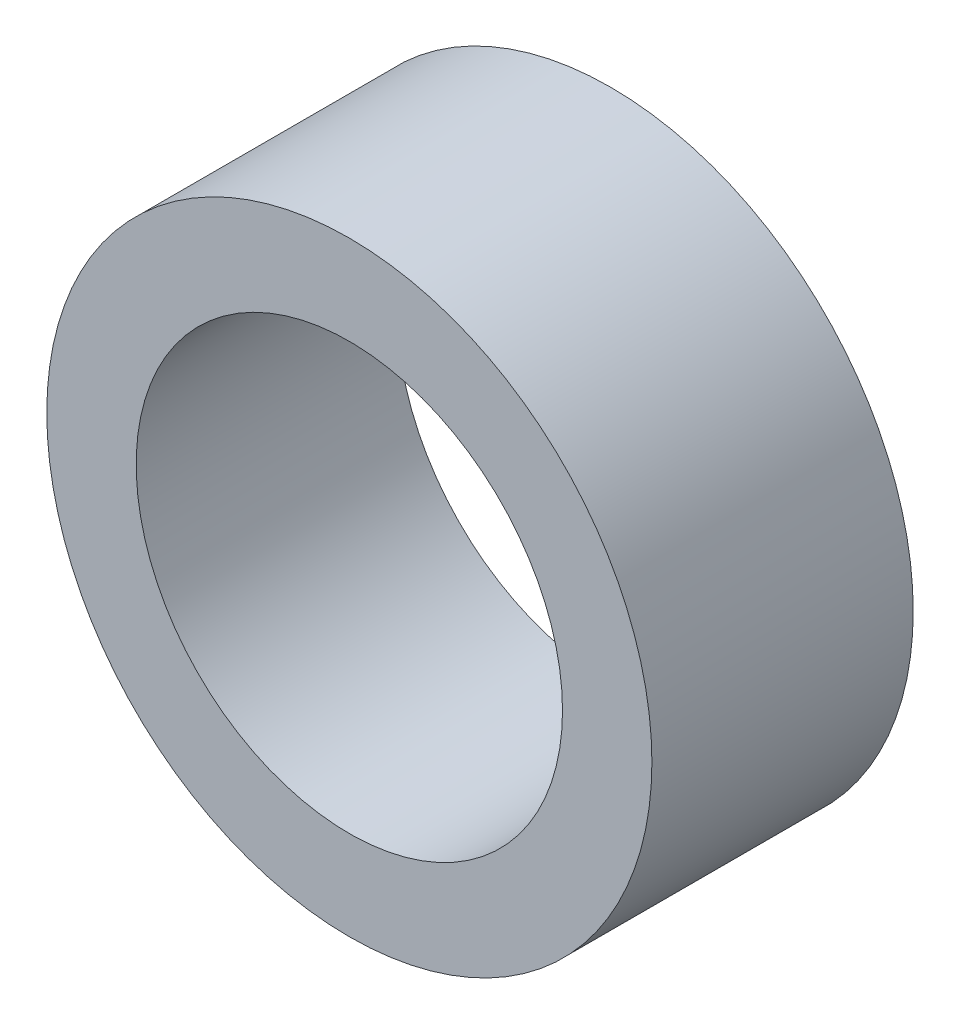
ISO-10303-21;
HEADER;
FILE_DESCRIPTION(('STEP AP214'),'2;1');
FILE_NAME('part.step','',(''),(''),'','','');
FILE_SCHEMA(('AUTOMOTIVE_DESIGN { 1 0 10303 214 1 1 1 1 }'));
ENDSEC;
DATA;
#1=APPLICATION_CONTEXT('core data for automotive mechanical design processes');
#2=APPLICATION_PROTOCOL_DEFINITION('international standard','automotive_design',2000,#1);
#3=PRODUCT_CONTEXT('',#1,'mechanical');
#4=PRODUCT('Part','Part','',(#3));
#5=PRODUCT_RELATED_PRODUCT_CATEGORY('part','',(#4));
#6=PRODUCT_DEFINITION_FORMATION('','',#4);
#7=PRODUCT_DEFINITION_CONTEXT('part definition',#1,'design');
#8=PRODUCT_DEFINITION('design','',#6,#7);
#9=PRODUCT_DEFINITION_SHAPE('','',#8);
#10=(LENGTH_UNIT() NAMED_UNIT(*) SI_UNIT(.MILLI.,.METRE.));
#11=(NAMED_UNIT(*) PLANE_ANGLE_UNIT() SI_UNIT($,.RADIAN.));
#12=(NAMED_UNIT(*) SI_UNIT($,.STERADIAN.) SOLID_ANGLE_UNIT());
#13=UNCERTAINTY_MEASURE_WITH_UNIT(LENGTH_MEASURE(1.E-05),#10,'distance_accuracy_value','');
#14=(GEOMETRIC_REPRESENTATION_CONTEXT(3) GLOBAL_UNCERTAINTY_ASSIGNED_CONTEXT((#13)) GLOBAL_UNIT_ASSIGNED_CONTEXT((#10,
#11,#12)) REPRESENTATION_CONTEXT('',''));
#15=CARTESIAN_POINT('',(0.,0.,0.));
#16=DIRECTION('',(0.,0.,1.));
#17=DIRECTION('',(1.,0.,0.));
#18=AXIS2_PLACEMENT_3D('',#15,#16,#17);
#19=CARTESIAN_POINT('',(0.,0.,42.));
#20=DIRECTION('',(0.,0.,1.));
#21=DIRECTION('',(1.,0.,0.));
#22=AXIS2_PLACEMENT_3D('',#19,#20,#21);
#23=PLANE('',#22);
#24=CARTESIAN_POINT('',(0.,0.,42.));
#25=DIRECTION('',(0.,0.,1.));
#26=DIRECTION('',(1.,0.,0.));
#27=AXIS2_PLACEMENT_3D('',#24,#25,#26);
#28=CIRCLE('',#27,22.);
#29=CARTESIAN_POINT('',(22.,0.,42.));
#30=VERTEX_POINT('',#29);
#31=EDGE_CURVE('E10',#30,#30,#28,.T.);
#32=ORIENTED_EDGE('',*,*,#31,.T.);
#33=EDGE_LOOP('',(#32));
#34=FACE_BOUND('',#33,.T.);
#35=CARTESIAN_POINT('',(0.,0.,42.));
#36=DIRECTION('',(0.,0.,1.));
#37=DIRECTION('',(1.,0.,0.));
#38=AXIS2_PLACEMENT_3D('',#35,#36,#37);
#39=CIRCLE('',#38,15.5);
#40=CARTESIAN_POINT('',(15.5,0.,42.));
#41=VERTEX_POINT('',#40);
#42=EDGE_CURVE('E48',#41,#41,#39,.T.);
#43=ORIENTED_EDGE('',*,*,#42,.F.);
#44=EDGE_LOOP('',(#43));
#45=FACE_BOUND('',#44,.T.);
#46=ADVANCED_FACE('F40',(#34,#45),#23,.T.);
#47=CARTESIAN_POINT('',(0.,0.,23.));
#48=DIRECTION('',(0.,0.,1.));
#49=DIRECTION('',(1.,0.,0.));
#50=AXIS2_PLACEMENT_3D('',#47,#48,#49);
#51=PLANE('',#50);
#52=CARTESIAN_POINT('',(0.,0.,23.));
#53=DIRECTION('',(0.,0.,1.));
#54=DIRECTION('',(1.,0.,0.));
#55=AXIS2_PLACEMENT_3D('',#52,#53,#54);
#56=CIRCLE('',#55,22.);
#57=CARTESIAN_POINT('',(22.,0.,23.));
#58=VERTEX_POINT('',#57);
#59=EDGE_CURVE('E41',#58,#58,#56,.T.);
#60=ORIENTED_EDGE('',*,*,#59,.F.);
#61=EDGE_LOOP('',(#60));
#62=FACE_BOUND('',#61,.T.);
#63=CARTESIAN_POINT('',(0.,0.,23.));
#64=DIRECTION('',(0.,0.,1.));
#65=DIRECTION('',(1.,0.,0.));
#66=AXIS2_PLACEMENT_3D('',#63,#64,#65);
#67=CIRCLE('',#66,15.5);
#68=CARTESIAN_POINT('',(15.5,0.,23.));
#69=VERTEX_POINT('',#68);
#70=EDGE_CURVE('E49',#69,#69,#67,.T.);
#71=ORIENTED_EDGE('',*,*,#70,.T.);
#72=EDGE_LOOP('',(#71));
#73=FACE_BOUND('',#72,.T.);
#74=ADVANCED_FACE('F58',(#62,#73),#51,.F.);
#75=CARTESIAN_POINT('',(0.,0.,42.));
#76=DIRECTION('',(0.,0.,-1.));
#77=DIRECTION('',(-1.,0.,0.));
#78=AXIS2_PLACEMENT_3D('',#75,#76,#77);
#79=CYLINDRICAL_SURFACE('',#78,22.);
#80=ORIENTED_EDGE('',*,*,#31,.F.);
#81=EDGE_LOOP('',(#80));
#82=FACE_BOUND('',#81,.T.);
#83=ORIENTED_EDGE('',*,*,#59,.T.);
#84=EDGE_LOOP('',(#83));
#85=FACE_BOUND('',#84,.T.);
#86=ADVANCED_FACE('F39',(#82,#85),#79,.T.);
#87=CARTESIAN_POINT('',(0.,0.,42.));
#88=DIRECTION('',(0.,0.,-1.));
#89=DIRECTION('',(-1.,0.,0.));
#90=AXIS2_PLACEMENT_3D('',#87,#88,#89);
#91=CYLINDRICAL_SURFACE('',#90,15.5);
#92=ORIENTED_EDGE('',*,*,#42,.T.);
#93=EDGE_LOOP('',(#92));
#94=FACE_BOUND('',#93,.T.);
#95=ORIENTED_EDGE('',*,*,#70,.F.);
#96=EDGE_LOOP('',(#95));
#97=FACE_BOUND('',#96,.T.);
#98=ADVANCED_FACE('F57',(#94,#97),#91,.F.);
#99=CLOSED_SHELL('',(#46,#74,#86,#98));
#100=MANIFOLD_SOLID_BREP('B2',#99);
#101=ADVANCED_BREP_SHAPE_REPRESENTATION('',(#18,#100),#14);
#102=SHAPE_DEFINITION_REPRESENTATION(#9,#101);
ENDSEC;
END-ISO-10303-21;
